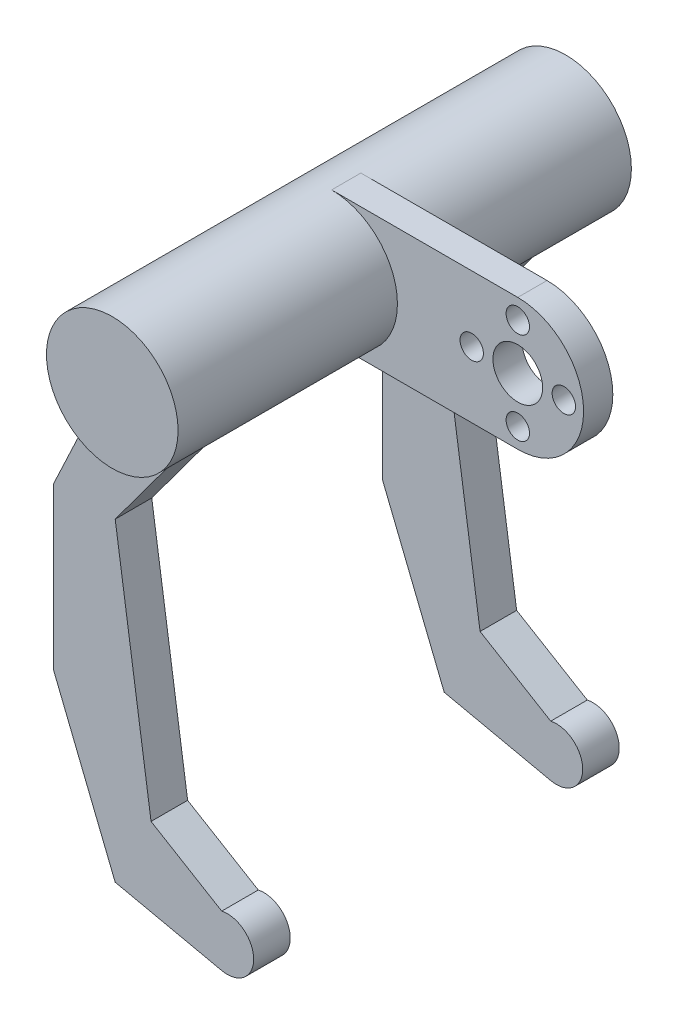
ISO-10303-21;
HEADER;
FILE_DESCRIPTION(('STEP AP214'),'2;1');
FILE_NAME('part.step','',(''),(''),'','','');
FILE_SCHEMA(('AUTOMOTIVE_DESIGN { 1 0 10303 214 1 1 1 1 }'));
ENDSEC;
DATA;
#1=APPLICATION_CONTEXT('core data for automotive mechanical design processes');
#2=APPLICATION_PROTOCOL_DEFINITION('international standard','automotive_design',2000,#1);
#3=PRODUCT_CONTEXT('',#1,'mechanical');
#4=PRODUCT('Part','Part','',(#3));
#5=PRODUCT_RELATED_PRODUCT_CATEGORY('part','',(#4));
#6=PRODUCT_DEFINITION_FORMATION('','',#4);
#7=PRODUCT_DEFINITION_CONTEXT('part definition',#1,'design');
#8=PRODUCT_DEFINITION('design','',#6,#7);
#9=PRODUCT_DEFINITION_SHAPE('','',#8);
#10=(LENGTH_UNIT() NAMED_UNIT(*) SI_UNIT(.MILLI.,.METRE.));
#11=(NAMED_UNIT(*) PLANE_ANGLE_UNIT() SI_UNIT($,.RADIAN.));
#12=(NAMED_UNIT(*) SI_UNIT($,.STERADIAN.) SOLID_ANGLE_UNIT());
#13=UNCERTAINTY_MEASURE_WITH_UNIT(LENGTH_MEASURE(1.E-05),#10,'distance_accuracy_value','');
#14=(GEOMETRIC_REPRESENTATION_CONTEXT(3) GLOBAL_UNCERTAINTY_ASSIGNED_CONTEXT((#13)) GLOBAL_UNIT_ASSIGNED_CONTEXT((#10,
#11,#12)) REPRESENTATION_CONTEXT('',''));
#15=CARTESIAN_POINT('',(0.,0.,0.));
#16=DIRECTION('',(0.,0.,1.));
#17=DIRECTION('',(1.,0.,0.));
#18=AXIS2_PLACEMENT_3D('',#15,#16,#17);
#19=CARTESIAN_POINT('',(0.,0.,5.08));
#20=DIRECTION('',(0.,0.,-1.));
#21=DIRECTION('',(-1.,0.,0.));
#22=AXIS2_PLACEMENT_3D('',#19,#20,#21);
#23=CYLINDRICAL_SURFACE('',#22,11.43);
#24=DIRECTION('',(0.,0.,-1.));
#25=VECTOR('',#24,1.);
#26=CARTESIAN_POINT('',(0.,11.43,5.08));
#27=LINE('',#26,#25);
#28=CARTESIAN_POINT('',(0.,11.43,5.08));
#29=VERTEX_POINT('',#28);
#30=CARTESIAN_POINT('',(0.,11.43,0.));
#31=VERTEX_POINT('',#30);
#32=EDGE_CURVE('E365',#29,#31,#27,.T.);
#33=ORIENTED_EDGE('',*,*,#32,.F.);
#34=CARTESIAN_POINT('',(0.,0.,5.08));
#35=DIRECTION('',(0.,0.,1.));
#36=DIRECTION('',(1.,0.,0.));
#37=AXIS2_PLACEMENT_3D('',#34,#35,#36);
#38=CIRCLE('',#37,11.43);
#39=CARTESIAN_POINT('',(0.,-11.43,5.08));
#40=VERTEX_POINT('',#39);
#41=EDGE_CURVE('E377',#40,#29,#38,.T.);
#42=ORIENTED_EDGE('',*,*,#41,.F.);
#43=DIRECTION('',(0.,0.,-1.));
#44=VECTOR('',#43,1.);
#45=CARTESIAN_POINT('',(0.,-11.43,5.08));
#46=LINE('',#45,#44);
#47=CARTESIAN_POINT('',(0.,-11.43,0.));
#48=VERTEX_POINT('',#47);
#49=EDGE_CURVE('E360',#40,#48,#46,.T.);
#50=ORIENTED_EDGE('',*,*,#49,.T.);
#51=CARTESIAN_POINT('',(0.,0.,0.));
#52=DIRECTION('',(0.,0.,1.));
#53=DIRECTION('',(1.,0.,0.));
#54=AXIS2_PLACEMENT_3D('',#51,#52,#53);
#55=CIRCLE('',#54,11.43);
#56=EDGE_CURVE('E368',#48,#31,#55,.T.);
#57=ORIENTED_EDGE('',*,*,#56,.T.);
#58=EDGE_LOOP('',(#33,#42,#50,#57));
#59=FACE_BOUND('',#58,.T.);
#60=ADVANCED_FACE('F37',(#59),#23,.T.);
#61=CARTESIAN_POINT('',(0.,0.,5.08));
#62=DIRECTION('',(0.,0.,1.));
#63=DIRECTION('',(1.,0.,0.));
#64=AXIS2_PLACEMENT_3D('',#61,#62,#63);
#65=PLANE('',#64);
#66=CARTESIAN_POINT('',(-32.3349284233711,0.,5.08));
#67=DIRECTION('',(0.,0.,1.));
#68=DIRECTION('',(1.,0.,0.));
#69=AXIS2_PLACEMENT_3D('',#66,#67,#68);
#70=CIRCLE('',#69,11.43);
#71=CARTESIAN_POINT('',(-32.3349284233711,-11.43,5.08));
#72=VERTEX_POINT('',#71);
#73=CARTESIAN_POINT('',(-32.3349284233711,11.43,5.08));
#74=VERTEX_POINT('',#73);
#75=EDGE_CURVE('E319',#72,#74,#70,.T.);
#76=ORIENTED_EDGE('',*,*,#75,.F.);
#77=DIRECTION('',(-1.,0.,0.));
#78=VECTOR('',#77,1.);
#79=CARTESIAN_POINT('',(0.,-11.43,5.08));
#80=LINE('',#79,#78);
#81=EDGE_CURVE('E353',#40,#72,#80,.T.);
#82=ORIENTED_EDGE('',*,*,#81,.F.);
#83=ORIENTED_EDGE('',*,*,#41,.T.);
#84=DIRECTION('',(1.,0.,0.));
#85=VECTOR('',#84,1.);
#86=CARTESIAN_POINT('',(0.,11.43,5.08));
#87=LINE('',#86,#85);
#88=EDGE_CURVE('E356',#74,#29,#87,.T.);
#89=ORIENTED_EDGE('',*,*,#88,.F.);
#90=EDGE_LOOP('',(#76,#82,#83,#89));
#91=FACE_BOUND('',#90,.T.);
#92=CARTESIAN_POINT('',(8.001,0.,5.08));
#93=DIRECTION('',(0.,0.,-1.));
#94=DIRECTION('',(0.,-1.,0.));
#95=AXIS2_PLACEMENT_3D('',#92,#93,#94);
#96=CIRCLE('',#95,2.032);
#97=CARTESIAN_POINT('',(8.00099999999998,-2.03200000000008,5.08));
#98=VERTEX_POINT('',#97);
#99=EDGE_CURVE('E323',#98,#98,#96,.T.);
#100=ORIENTED_EDGE('',*,*,#99,.T.);
#101=EDGE_LOOP('',(#100));
#102=FACE_BOUND('',#101,.T.);
#103=CARTESIAN_POINT('',(0.,8.001,5.08));
#104=DIRECTION('',(0.,0.,-1.));
#105=DIRECTION('',(1.,0.,0.));
#106=AXIS2_PLACEMENT_3D('',#103,#104,#105);
#107=CIRCLE('',#106,2.032);
#108=CARTESIAN_POINT('',(2.032,8.001,5.08));
#109=VERTEX_POINT('',#108);
#110=EDGE_CURVE('E329',#109,#109,#107,.T.);
#111=ORIENTED_EDGE('',*,*,#110,.T.);
#112=EDGE_LOOP('',(#111));
#113=FACE_BOUND('',#112,.T.);
#114=CARTESIAN_POINT('',(-8.001,0.,5.08));
#115=DIRECTION('',(0.,0.,-1.));
#116=DIRECTION('',(0.,1.,0.));
#117=AXIS2_PLACEMENT_3D('',#114,#115,#116);
#118=CIRCLE('',#117,2.032);
#119=CARTESIAN_POINT('',(-8.00099999999999,2.03200000000003,5.08));
#120=VERTEX_POINT('',#119);
#121=EDGE_CURVE('E335',#120,#120,#118,.T.);
#122=ORIENTED_EDGE('',*,*,#121,.T.);
#123=EDGE_LOOP('',(#122));
#124=FACE_BOUND('',#123,.T.);
#125=CARTESIAN_POINT('',(0.,-8.001,5.08));
#126=DIRECTION('',(0.,0.,-1.));
#127=DIRECTION('',(-1.,0.,0.));
#128=AXIS2_PLACEMENT_3D('',#125,#126,#127);
#129=CIRCLE('',#128,2.032);
#130=CARTESIAN_POINT('',(-2.032,-8.001,5.08));
#131=VERTEX_POINT('',#130);
#132=EDGE_CURVE('E341',#131,#131,#129,.T.);
#133=ORIENTED_EDGE('',*,*,#132,.T.);
#134=EDGE_LOOP('',(#133));
#135=FACE_BOUND('',#134,.T.);
#136=CARTESIAN_POINT('',(0.,0.,5.08));
#137=DIRECTION('',(0.,0.,-1.));
#138=DIRECTION('',(-1.,0.,0.));
#139=AXIS2_PLACEMENT_3D('',#136,#137,#138);
#140=CIRCLE('',#139,4.318);
#141=CARTESIAN_POINT('',(-4.318,0.,5.08));
#142=VERTEX_POINT('',#141);
#143=EDGE_CURVE('E347',#142,#142,#140,.T.);
#144=ORIENTED_EDGE('',*,*,#143,.T.);
#145=EDGE_LOOP('',(#144));
#146=FACE_BOUND('',#145,.T.);
#147=ADVANCED_FACE('F432',(#91,#102,#113,#124,#135,#146),#65,.T.);
#148=CARTESIAN_POINT('',(0.,0.,0.));
#149=DIRECTION('',(0.,0.,1.));
#150=DIRECTION('',(1.,0.,0.));
#151=AXIS2_PLACEMENT_3D('',#148,#149,#150);
#152=PLANE('',#151);
#153=CARTESIAN_POINT('',(8.001,0.,0.));
#154=DIRECTION('',(0.,0.,-1.));
#155=DIRECTION('',(0.,-1.,0.));
#156=AXIS2_PLACEMENT_3D('',#153,#154,#155);
#157=CIRCLE('',#156,2.032);
#158=CARTESIAN_POINT('',(8.00099999999998,-2.03200000000008,0.));
#159=VERTEX_POINT('',#158);
#160=EDGE_CURVE('E322',#159,#159,#157,.T.);
#161=ORIENTED_EDGE('',*,*,#160,.F.);
#162=EDGE_LOOP('',(#161));
#163=FACE_BOUND('',#162,.T.);
#164=CARTESIAN_POINT('',(0.,8.001,0.));
#165=DIRECTION('',(0.,0.,-1.));
#166=DIRECTION('',(1.,0.,0.));
#167=AXIS2_PLACEMENT_3D('',#164,#165,#166);
#168=CIRCLE('',#167,2.032);
#169=CARTESIAN_POINT('',(2.032,8.001,0.));
#170=VERTEX_POINT('',#169);
#171=EDGE_CURVE('E326',#170,#170,#168,.T.);
#172=ORIENTED_EDGE('',*,*,#171,.F.);
#173=EDGE_LOOP('',(#172));
#174=FACE_BOUND('',#173,.T.);
#175=CARTESIAN_POINT('',(-8.001,0.,0.));
#176=DIRECTION('',(0.,0.,-1.));
#177=DIRECTION('',(0.,1.,0.));
#178=AXIS2_PLACEMENT_3D('',#175,#176,#177);
#179=CIRCLE('',#178,2.032);
#180=CARTESIAN_POINT('',(-8.00099999999999,2.03200000000003,0.));
#181=VERTEX_POINT('',#180);
#182=EDGE_CURVE('E332',#181,#181,#179,.T.);
#183=ORIENTED_EDGE('',*,*,#182,.F.);
#184=EDGE_LOOP('',(#183));
#185=FACE_BOUND('',#184,.T.);
#186=CARTESIAN_POINT('',(0.,-8.001,0.));
#187=DIRECTION('',(0.,0.,-1.));
#188=DIRECTION('',(-1.,0.,0.));
#189=AXIS2_PLACEMENT_3D('',#186,#187,#188);
#190=CIRCLE('',#189,2.032);
#191=CARTESIAN_POINT('',(-2.032,-8.001,0.));
#192=VERTEX_POINT('',#191);
#193=EDGE_CURVE('E338',#192,#192,#190,.T.);
#194=ORIENTED_EDGE('',*,*,#193,.F.);
#195=EDGE_LOOP('',(#194));
#196=FACE_BOUND('',#195,.T.);
#197=CARTESIAN_POINT('',(0.,0.,0.));
#198=DIRECTION('',(0.,0.,-1.));
#199=DIRECTION('',(-1.,0.,0.));
#200=AXIS2_PLACEMENT_3D('',#197,#198,#199);
#201=CIRCLE('',#200,4.318);
#202=CARTESIAN_POINT('',(-4.318,0.,0.));
#203=VERTEX_POINT('',#202);
#204=EDGE_CURVE('E344',#203,#203,#201,.T.);
#205=ORIENTED_EDGE('',*,*,#204,.F.);
#206=EDGE_LOOP('',(#205));
#207=FACE_BOUND('',#206,.T.);
#208=DIRECTION('',(-1.,0.,0.));
#209=VECTOR('',#208,1.);
#210=CARTESIAN_POINT('',(0.,-11.43,0.));
#211=LINE('',#210,#209);
#212=CARTESIAN_POINT('',(-32.3349284233711,-11.43,0.));
#213=VERTEX_POINT('',#212);
#214=EDGE_CURVE('E350',#48,#213,#211,.T.);
#215=ORIENTED_EDGE('',*,*,#214,.T.);
#216=CARTESIAN_POINT('',(-32.3349284233711,0.,0.));
#217=DIRECTION('',(0.,0.,1.));
#218=DIRECTION('',(1.,0.,0.));
#219=AXIS2_PLACEMENT_3D('',#216,#217,#218);
#220=CIRCLE('',#219,11.43);
#221=CARTESIAN_POINT('',(-32.3349284233711,11.43,0.));
#222=VERTEX_POINT('',#221);
#223=EDGE_CURVE('E317',#213,#222,#220,.T.);
#224=ORIENTED_EDGE('',*,*,#223,.T.);
#225=DIRECTION('',(1.,0.,0.));
#226=VECTOR('',#225,1.);
#227=CARTESIAN_POINT('',(0.,11.43,0.));
#228=LINE('',#227,#226);
#229=EDGE_CURVE('E357',#222,#31,#228,.T.);
#230=ORIENTED_EDGE('',*,*,#229,.T.);
#231=ORIENTED_EDGE('',*,*,#56,.F.);
#232=EDGE_LOOP('',(#215,#224,#230,#231));
#233=FACE_BOUND('',#232,.T.);
#234=ADVANCED_FACE('F437',(#163,#174,#185,#196,#207,#233),#152,.F.);
#235=CARTESIAN_POINT('',(0.,11.43,5.08));
#236=DIRECTION('',(0.,1.,0.));
#237=DIRECTION('',(0.,0.,1.));
#238=AXIS2_PLACEMENT_3D('',#235,#236,#237);
#239=PLANE('',#238);
#240=ORIENTED_EDGE('',*,*,#229,.F.);
#241=DIRECTION('',(0.,0.,-1.));
#242=VECTOR('',#241,1.);
#243=CARTESIAN_POINT('',(-32.3349284233711,11.43,5.08));
#244=LINE('',#243,#242);
#245=EDGE_CURVE('E369',#74,#222,#244,.T.);
#246=ORIENTED_EDGE('',*,*,#245,.F.);
#247=ORIENTED_EDGE('',*,*,#88,.T.);
#248=ORIENTED_EDGE('',*,*,#32,.T.);
#249=EDGE_LOOP('',(#240,#246,#247,#248));
#250=FACE_BOUND('',#249,.T.);
#251=ADVANCED_FACE('F446',(#250),#239,.T.);
#252=CARTESIAN_POINT('',(-32.3349284233711,0.,5.08));
#253=DIRECTION('',(0.,0.,-1.));
#254=DIRECTION('',(-1.,0.,0.));
#255=AXIS2_PLACEMENT_3D('',#252,#253,#254);
#256=CYLINDRICAL_SURFACE('',#255,11.43);
#257=CARTESIAN_POINT('',(-32.3349284233711,0.,25.4));
#258=DIRECTION('',(0.,0.,-1.));
#259=DIRECTION('',(-1.,0.,0.));
#260=AXIS2_PLACEMENT_3D('',#257,#258,#259);
#261=CIRCLE('',#260,11.43);
#262=CARTESIAN_POINT('',(-42.3406749358484,-5.5253901878555,25.4));
#263=VERTEX_POINT('',#262);
#264=CARTESIAN_POINT('',(-28.9893938916271,-10.9294235299447,25.4));
#265=VERTEX_POINT('',#264);
#266=EDGE_CURVE('E11',#263,#265,#261,.F.);
#267=ORIENTED_EDGE('',*,*,#266,.F.);
#268=DIRECTION('',(0.,0.,-1.));
#269=VECTOR('',#268,1.);
#270=CARTESIAN_POINT('',(-42.3406749358484,-5.5253901878555,5.08));
#271=LINE('',#270,#269);
#272=CARTESIAN_POINT('',(-42.3406749358484,-5.5253901878555,31.75));
#273=VERTEX_POINT('',#272);
#274=EDGE_CURVE('E44',#273,#263,#271,.T.);
#275=ORIENTED_EDGE('',*,*,#274,.F.);
#276=CARTESIAN_POINT('',(-32.3349284233711,0.,31.75));
#277=DIRECTION('',(0.,0.,-1.));
#278=DIRECTION('',(-1.,0.,0.));
#279=AXIS2_PLACEMENT_3D('',#276,#277,#278);
#280=CIRCLE('',#279,11.43);
#281=CARTESIAN_POINT('',(-28.9893938916271,-10.9294235299447,31.75));
#282=VERTEX_POINT('',#281);
#283=EDGE_CURVE('E392',#273,#282,#280,.F.);
#284=ORIENTED_EDGE('',*,*,#283,.T.);
#285=DIRECTION('',(0.,0.,-1.));
#286=VECTOR('',#285,1.);
#287=CARTESIAN_POINT('',(-28.9893938916271,-10.9294235299447,5.08));
#288=LINE('',#287,#286);
#289=EDGE_CURVE('E395',#265,#282,#288,.F.);
#290=ORIENTED_EDGE('',*,*,#289,.F.);
#291=EDGE_LOOP('',(#267,#275,#284,#290));
#292=FACE_BOUND('',#291,.T.);
#293=CARTESIAN_POINT('',(-32.3349284233711,0.,-25.4));
#294=DIRECTION('',(0.,0.,1.));
#295=DIRECTION('',(1.,0.,0.));
#296=AXIS2_PLACEMENT_3D('',#293,#294,#295);
#297=CIRCLE('',#296,11.43);
#298=CARTESIAN_POINT('',(-28.9893938916271,-10.9294235299447,-25.4));
#299=VERTEX_POINT('',#298);
#300=CARTESIAN_POINT('',(-42.3406749358484,-5.5253901878555,-25.4));
#301=VERTEX_POINT('',#300);
#302=EDGE_CURVE('E390',#299,#301,#297,.F.);
#303=ORIENTED_EDGE('',*,*,#302,.F.);
#304=DIRECTION('',(0.,0.,-1.));
#305=VECTOR('',#304,1.);
#306=CARTESIAN_POINT('',(-28.9893938916271,-10.9294235299447,5.08));
#307=LINE('',#306,#305);
#308=CARTESIAN_POINT('',(-28.9893938916271,-10.9294235299447,-31.75));
#309=VERTEX_POINT('',#308);
#310=EDGE_CURVE('E387',#299,#309,#307,.T.);
#311=ORIENTED_EDGE('',*,*,#310,.T.);
#312=CARTESIAN_POINT('',(-32.3349284233711,0.,-31.75));
#313=DIRECTION('',(0.,0.,1.));
#314=DIRECTION('',(1.,0.,0.));
#315=AXIS2_PLACEMENT_3D('',#312,#313,#314);
#316=CIRCLE('',#315,11.43);
#317=CARTESIAN_POINT('',(-42.3406749358484,-5.5253901878555,-31.75));
#318=VERTEX_POINT('',#317);
#319=EDGE_CURVE('E380',#309,#318,#316,.F.);
#320=ORIENTED_EDGE('',*,*,#319,.T.);
#321=DIRECTION('',(0.,0.,-1.));
#322=VECTOR('',#321,1.);
#323=CARTESIAN_POINT('',(-42.3406749358484,-5.5253901878555,5.08));
#324=LINE('',#323,#322);
#325=EDGE_CURVE('E384',#318,#301,#324,.F.);
#326=ORIENTED_EDGE('',*,*,#325,.T.);
#327=EDGE_LOOP('',(#303,#311,#320,#326));
#328=FACE_BOUND('',#327,.T.);
#329=ORIENTED_EDGE('',*,*,#245,.T.);
#330=ORIENTED_EDGE('',*,*,#223,.F.);
#331=DIRECTION('',(0.,0.,-1.));
#332=VECTOR('',#331,1.);
#333=CARTESIAN_POINT('',(-32.3349284233711,-11.43,5.08));
#334=LINE('',#333,#332);
#335=EDGE_CURVE('E372',#72,#213,#334,.T.);
#336=ORIENTED_EDGE('',*,*,#335,.F.);
#337=ORIENTED_EDGE('',*,*,#75,.T.);
#338=EDGE_LOOP('',(#329,#330,#336,#337));
#339=FACE_BOUND('',#338,.T.);
#340=CARTESIAN_POINT('',(-32.3349284233711,0.,-35.56));
#341=DIRECTION('',(0.,0.,1.));
#342=DIRECTION('',(1.,0.,0.));
#343=AXIS2_PLACEMENT_3D('',#340,#341,#342);
#344=CIRCLE('',#343,11.43);
#345=CARTESIAN_POINT('',(-20.9049284233711,0.,-35.56));
#346=VERTEX_POINT('',#345);
#347=EDGE_CURVE('E314',#346,#346,#344,.T.);
#348=ORIENTED_EDGE('',*,*,#347,.T.);
#349=EDGE_LOOP('',(#348));
#350=FACE_BOUND('',#349,.T.);
#351=CARTESIAN_POINT('',(-32.3349284233711,0.,43.18));
#352=DIRECTION('',(0.,0.,1.));
#353=DIRECTION('',(1.,0.,0.));
#354=AXIS2_PLACEMENT_3D('',#351,#352,#353);
#355=CIRCLE('',#354,11.43);
#356=CARTESIAN_POINT('',(-20.9049284233711,0.,43.18));
#357=VERTEX_POINT('',#356);
#358=EDGE_CURVE('E311',#357,#357,#355,.T.);
#359=ORIENTED_EDGE('',*,*,#358,.F.);
#360=EDGE_LOOP('',(#359));
#361=FACE_BOUND('',#360,.T.);
#362=ADVANCED_FACE('F405',(#292,#328,#339,#350,#361),#256,.T.);
#363=CARTESIAN_POINT('',(0.,-11.43,5.08));
#364=DIRECTION('',(0.,-1.,0.));
#365=DIRECTION('',(0.,0.,-1.));
#366=AXIS2_PLACEMENT_3D('',#363,#364,#365);
#367=PLANE('',#366);
#368=ORIENTED_EDGE('',*,*,#214,.F.);
#369=ORIENTED_EDGE('',*,*,#49,.F.);
#370=ORIENTED_EDGE('',*,*,#81,.T.);
#371=ORIENTED_EDGE('',*,*,#335,.T.);
#372=EDGE_LOOP('',(#368,#369,#370,#371));
#373=FACE_BOUND('',#372,.T.);
#374=ADVANCED_FACE('F452',(#373),#367,.T.);
#375=CARTESIAN_POINT('',(0.,0.,5.08));
#376=DIRECTION('',(0.,0.,-1.));
#377=DIRECTION('',(-1.,0.,0.));
#378=AXIS2_PLACEMENT_3D('',#375,#376,#377);
#379=CYLINDRICAL_SURFACE('',#378,4.318);
#380=ORIENTED_EDGE('',*,*,#143,.F.);
#381=EDGE_LOOP('',(#380));
#382=FACE_BOUND('',#381,.T.);
#383=ORIENTED_EDGE('',*,*,#204,.T.);
#384=EDGE_LOOP('',(#383));
#385=FACE_BOUND('',#384,.T.);
#386=ADVANCED_FACE('F465',(#382,#385),#379,.F.);
#387=CARTESIAN_POINT('',(0.,-8.001,5.08));
#388=DIRECTION('',(0.,0.,-1.));
#389=DIRECTION('',(-1.,0.,0.));
#390=AXIS2_PLACEMENT_3D('',#387,#388,#389);
#391=CYLINDRICAL_SURFACE('',#390,2.032);
#392=ORIENTED_EDGE('',*,*,#132,.F.);
#393=EDGE_LOOP('',(#392));
#394=FACE_BOUND('',#393,.T.);
#395=ORIENTED_EDGE('',*,*,#193,.T.);
#396=EDGE_LOOP('',(#395));
#397=FACE_BOUND('',#396,.T.);
#398=ADVANCED_FACE('F470',(#394,#397),#391,.F.);
#399=CARTESIAN_POINT('',(-8.001,0.,5.08));
#400=DIRECTION('',(0.,0.,-1.));
#401=DIRECTION('',(-1.,0.,0.));
#402=AXIS2_PLACEMENT_3D('',#399,#400,#401);
#403=CYLINDRICAL_SURFACE('',#402,2.032);
#404=ORIENTED_EDGE('',*,*,#121,.F.);
#405=EDGE_LOOP('',(#404));
#406=FACE_BOUND('',#405,.T.);
#407=ORIENTED_EDGE('',*,*,#182,.T.);
#408=EDGE_LOOP('',(#407));
#409=FACE_BOUND('',#408,.T.);
#410=ADVANCED_FACE('F474',(#406,#409),#403,.F.);
#411=CARTESIAN_POINT('',(0.,8.001,5.08));
#412=DIRECTION('',(0.,0.,-1.));
#413=DIRECTION('',(-1.,0.,0.));
#414=AXIS2_PLACEMENT_3D('',#411,#412,#413);
#415=CYLINDRICAL_SURFACE('',#414,2.032);
#416=ORIENTED_EDGE('',*,*,#110,.F.);
#417=EDGE_LOOP('',(#416));
#418=FACE_BOUND('',#417,.T.);
#419=ORIENTED_EDGE('',*,*,#171,.T.);
#420=EDGE_LOOP('',(#419));
#421=FACE_BOUND('',#420,.T.);
#422=ADVANCED_FACE('F478',(#418,#421),#415,.F.);
#423=CARTESIAN_POINT('',(8.001,0.,5.08));
#424=DIRECTION('',(0.,0.,-1.));
#425=DIRECTION('',(-1.,0.,0.));
#426=AXIS2_PLACEMENT_3D('',#423,#424,#425);
#427=CYLINDRICAL_SURFACE('',#426,2.032);
#428=ORIENTED_EDGE('',*,*,#99,.F.);
#429=EDGE_LOOP('',(#428));
#430=FACE_BOUND('',#429,.T.);
#431=ORIENTED_EDGE('',*,*,#160,.T.);
#432=EDGE_LOOP('',(#431));
#433=FACE_BOUND('',#432,.T.);
#434=ADVANCED_FACE('F482',(#430,#433),#427,.F.);
#435=CARTESIAN_POINT('',(-32.3349284233711,0.,-35.56));
#436=DIRECTION('',(0.,0.,1.));
#437=DIRECTION('',(1.,0.,0.));
#438=AXIS2_PLACEMENT_3D('',#435,#436,#437);
#439=PLANE('',#438);
#440=ORIENTED_EDGE('',*,*,#347,.F.);
#441=EDGE_LOOP('',(#440));
#442=FACE_BOUND('',#441,.T.);
#443=ADVANCED_FACE('F486',(#442),#439,.F.);
#444=CARTESIAN_POINT('',(-32.3349284233711,0.,43.18));
#445=DIRECTION('',(0.,0.,1.));
#446=DIRECTION('',(1.,0.,0.));
#447=AXIS2_PLACEMENT_3D('',#444,#445,#446);
#448=PLANE('',#447);
#449=ORIENTED_EDGE('',*,*,#358,.T.);
#450=EDGE_LOOP('',(#449));
#451=FACE_BOUND('',#450,.T.);
#452=ADVANCED_FACE('F490',(#451),#448,.T.);
#453=CARTESIAN_POINT('',(-19.6126188759609,-89.9951673660762,-25.4));
#454=DIRECTION('',(0.21293191641022,0.977067039140033,0.));
#455=DIRECTION('',(-0.977067039140033,0.21293191641022,0.));
#456=AXIS2_PLACEMENT_3D('',#453,#454,#455);
#457=PLANE('',#456);
#458=DIRECTION('',(0.977067039140033,-0.21293191641022,0.));
#459=VECTOR('',#458,1.);
#460=CARTESIAN_POINT('',(-19.6126188759609,-89.9951673660762,-31.75));
#461=LINE('',#460,#459);
#462=CARTESIAN_POINT('',(-43.2582780653794,-84.8420762021196,-31.75));
#463=VERTEX_POINT('',#462);
#464=CARTESIAN_POINT('',(-24.7565964514207,-88.8741419305259,-31.75));
#465=VERTEX_POINT('',#464);
#466=EDGE_CURVE('E196',#463,#465,#461,.T.);
#467=ORIENTED_EDGE('',*,*,#466,.T.);
#468=DIRECTION('',(0.,0.,-1.));
#469=VECTOR('',#468,1.);
#470=CARTESIAN_POINT('',(-24.7565964514207,-88.8741419305259,-25.4));
#471=LINE('',#470,#469);
#472=CARTESIAN_POINT('',(-24.7565964514207,-88.8741419305259,-25.4));
#473=VERTEX_POINT('',#472);
#474=EDGE_CURVE('E308',#473,#465,#471,.T.);
#475=ORIENTED_EDGE('',*,*,#474,.F.);
#476=DIRECTION('',(0.977067039140033,-0.21293191641022,0.));
#477=VECTOR('',#476,1.);
#478=CARTESIAN_POINT('',(-19.6126188759609,-89.9951673660762,-25.4));
#479=LINE('',#478,#477);
#480=CARTESIAN_POINT('',(-43.2582780653794,-84.8420762021196,-25.4));
#481=VERTEX_POINT('',#480);
#482=EDGE_CURVE('E256',#481,#473,#479,.T.);
#483=ORIENTED_EDGE('',*,*,#482,.F.);
#484=DIRECTION('',(0.,0.,-1.));
#485=VECTOR('',#484,1.);
#486=CARTESIAN_POINT('',(-43.2582780653794,-84.8420762021196,-25.4));
#487=LINE('',#486,#485);
#488=EDGE_CURVE('E275',#481,#463,#487,.T.);
#489=ORIENTED_EDGE('',*,*,#488,.T.);
#490=EDGE_LOOP('',(#467,#475,#483,#489));
#491=FACE_BOUND('',#490,.T.);
#492=ADVANCED_FACE('F494',(#491),#457,.F.);
#493=CARTESIAN_POINT('',(-23.782450871958,-84.404142537935,-25.4));
#494=DIRECTION('',(0.,0.,-1.));
#495=DIRECTION('',(-1.,0.,0.));
#496=AXIS2_PLACEMENT_3D('',#493,#494,#495);
#497=CYLINDRICAL_SURFACE('',#496,4.57491575657402);
#498=CARTESIAN_POINT('',(-23.782450871958,-84.404142537935,-31.75));
#499=DIRECTION('',(0.,0.,1.));
#500=DIRECTION('',(1.,0.,0.));
#501=AXIS2_PLACEMENT_3D('',#498,#499,#500);
#502=CIRCLE('',#501,4.57491575657402);
#503=CARTESIAN_POINT('',(-24.7565964514207,-79.9341431453442,-31.75));
#504=VERTEX_POINT('',#503);
#505=EDGE_CURVE('E278',#465,#504,#502,.T.);
#506=ORIENTED_EDGE('',*,*,#505,.T.);
#507=DIRECTION('',(0.,0.,-1.));
#508=VECTOR('',#507,1.);
#509=CARTESIAN_POINT('',(-24.7565964514207,-79.9341431453442,-25.4));
#510=LINE('',#509,#508);
#511=CARTESIAN_POINT('',(-24.7565964514207,-79.9341431453442,-25.4));
#512=VERTEX_POINT('',#511);
#513=EDGE_CURVE('E305',#512,#504,#510,.T.);
#514=ORIENTED_EDGE('',*,*,#513,.F.);
#515=CARTESIAN_POINT('',(-23.782450871958,-84.404142537935,-25.4));
#516=DIRECTION('',(0.,0.,1.));
#517=DIRECTION('',(1.,0.,0.));
#518=AXIS2_PLACEMENT_3D('',#515,#516,#517);
#519=CIRCLE('',#518,4.57491575657402);
#520=EDGE_CURVE('E259',#473,#512,#519,.T.);
#521=ORIENTED_EDGE('',*,*,#520,.F.);
#522=ORIENTED_EDGE('',*,*,#474,.T.);
#523=EDGE_LOOP('',(#506,#514,#521,#522));
#524=FACE_BOUND('',#523,.T.);
#525=ADVANCED_FACE('F498',(#524),#497,.T.);
#526=CARTESIAN_POINT('',(-41.7778302735173,-69.737133588558,-25.4));
#527=DIRECTION('',(-0.513912692768161,-0.857842493824932,0.));
#528=DIRECTION('',(0.857842493824932,-0.513912692768161,0.));
#529=AXIS2_PLACEMENT_3D('',#526,#527,#528);
#530=PLANE('',#529);
#531=DIRECTION('',(-0.857842493824932,0.513912692768161,0.));
#532=VECTOR('',#531,1.);
#533=CARTESIAN_POINT('',(-41.7778302735173,-69.737133588558,-31.75));
#534=LINE('',#533,#532);
#535=CARTESIAN_POINT('',(-37.0287334536283,-72.582202645517,-31.75));
#536=VERTEX_POINT('',#535);
#537=EDGE_CURVE('E280',#504,#536,#534,.T.);
#538=ORIENTED_EDGE('',*,*,#537,.T.);
#539=DIRECTION('',(0.,0.,-1.));
#540=VECTOR('',#539,1.);
#541=CARTESIAN_POINT('',(-37.0287334536283,-72.582202645517,-25.4));
#542=LINE('',#541,#540);
#543=CARTESIAN_POINT('',(-37.0287334536283,-72.582202645517,-25.4));
#544=VERTEX_POINT('',#543);
#545=EDGE_CURVE('E302',#544,#536,#542,.T.);
#546=ORIENTED_EDGE('',*,*,#545,.F.);
#547=DIRECTION('',(-0.857842493824932,0.513912692768161,0.));
#548=VECTOR('',#547,1.);
#549=CARTESIAN_POINT('',(-41.7778302735173,-69.737133588558,-25.4));
#550=LINE('',#549,#548);
#551=EDGE_CURVE('E262',#512,#544,#550,.T.);
#552=ORIENTED_EDGE('',*,*,#551,.F.);
#553=ORIENTED_EDGE('',*,*,#513,.T.);
#554=EDGE_LOOP('',(#538,#546,#552,#553));
#555=FACE_BOUND('',#554,.T.);
#556=ADVANCED_FACE('F502',(#555),#530,.F.);
#557=CARTESIAN_POINT('',(-46.69245255912,-6.86625995800534,-25.4));
#558=DIRECTION('',(-0.989359980769738,-0.14548824162558,0.));
#559=DIRECTION('',(0.14548824162558,-0.989359980769738,0.));
#560=AXIS2_PLACEMENT_3D('',#557,#558,#559);
#561=PLANE('',#560);
#562=DIRECTION('',(-0.14548824162558,0.989359980769738,0.));
#563=VECTOR('',#562,1.);
#564=CARTESIAN_POINT('',(-46.69245255912,-6.86625995800534,-31.75));
#565=LINE('',#564,#563);
#566=CARTESIAN_POINT('',(-43.2582780653794,-30.2195892245116,-31.75));
#567=VERTEX_POINT('',#566);
#568=EDGE_CURVE('E282',#536,#567,#565,.T.);
#569=ORIENTED_EDGE('',*,*,#568,.T.);
#570=DIRECTION('',(0.,0.,-1.));
#571=VECTOR('',#570,1.);
#572=CARTESIAN_POINT('',(-43.2582780653794,-30.2195892245116,-25.4));
#573=LINE('',#572,#571);
#574=CARTESIAN_POINT('',(-43.2582780653794,-30.2195892245116,-25.4));
#575=VERTEX_POINT('',#574);
#576=EDGE_CURVE('E299',#575,#567,#573,.T.);
#577=ORIENTED_EDGE('',*,*,#576,.F.);
#578=DIRECTION('',(-0.14548824162558,0.989359980769738,0.));
#579=VECTOR('',#578,1.);
#580=CARTESIAN_POINT('',(-46.69245255912,-6.86625995800534,-25.4));
#581=LINE('',#580,#579);
#582=EDGE_CURVE('E264',#544,#575,#581,.T.);
#583=ORIENTED_EDGE('',*,*,#582,.F.);
#584=ORIENTED_EDGE('',*,*,#545,.T.);
#585=EDGE_LOOP('',(#569,#577,#583,#584));
#586=FACE_BOUND('',#585,.T.);
#587=ADVANCED_FACE('F506',(#586),#561,.F.);
#588=CARTESIAN_POINT('',(-13.5118762818529,9.99469888898521,-25.4));
#589=DIRECTION('',(-0.803958234088395,0.594685763947204,0.));
#590=DIRECTION('',(-0.594685763947204,-0.803958234088395,0.));
#591=AXIS2_PLACEMENT_3D('',#588,#589,#590);
#592=PLANE('',#591);
#593=ORIENTED_EDGE('',*,*,#310,.F.);
#594=DIRECTION('',(0.594685763947204,0.803958234088395,0.));
#595=VECTOR('',#594,1.);
#596=CARTESIAN_POINT('',(-13.5118762818529,9.99469888898521,-25.4));
#597=LINE('',#596,#595);
#598=EDGE_CURVE('E266',#575,#299,#597,.T.);
#599=ORIENTED_EDGE('',*,*,#598,.F.);
#600=ORIENTED_EDGE('',*,*,#576,.T.);
#601=DIRECTION('',(0.594685763947204,0.803958234088395,0.));
#602=VECTOR('',#601,1.);
#603=CARTESIAN_POINT('',(-13.5118762818529,9.99469888898521,-31.75));
#604=LINE('',#603,#602);
#605=EDGE_CURVE('E284',#567,#309,#604,.T.);
#606=ORIENTED_EDGE('',*,*,#605,.T.);
#607=EDGE_LOOP('',(#593,#599,#600,#606));
#608=FACE_BOUND('',#607,.T.);
#609=ADVANCED_FACE('F510',(#608),#592,.F.);
#610=CARTESIAN_POINT('',(-32.5487555072774,15.302389340127,-25.4));
#611=DIRECTION('',(0.90497580646386,-0.425463029786473,0.));
#612=DIRECTION('',(0.425463029786473,0.90497580646386,0.));
#613=AXIS2_PLACEMENT_3D('',#610,#611,#612);
#614=PLANE('',#613);
#615=ORIENTED_EDGE('',*,*,#325,.F.);
#616=DIRECTION('',(-0.425463029786473,-0.90497580646386,0.));
#617=VECTOR('',#616,1.);
#618=CARTESIAN_POINT('',(-32.5487555072774,15.302389340127,-31.75));
#619=LINE('',#618,#617);
#620=CARTESIAN_POINT('',(-53.9503430233736,-30.2195892245116,-31.75));
#621=VERTEX_POINT('',#620);
#622=EDGE_CURVE('E59',#318,#621,#619,.T.);
#623=ORIENTED_EDGE('',*,*,#622,.T.);
#624=DIRECTION('',(0.,0.,-1.));
#625=VECTOR('',#624,1.);
#626=CARTESIAN_POINT('',(-53.9503430233736,-30.2195892245116,-25.4));
#627=LINE('',#626,#625);
#628=CARTESIAN_POINT('',(-53.9503430233736,-30.2195892245116,-25.4));
#629=VERTEX_POINT('',#628);
#630=EDGE_CURVE('E296',#629,#621,#627,.T.);
#631=ORIENTED_EDGE('',*,*,#630,.F.);
#632=DIRECTION('',(-0.425463029786473,-0.90497580646386,0.));
#633=VECTOR('',#632,1.);
#634=CARTESIAN_POINT('',(-32.5487555072774,15.302389340127,-25.4));
#635=LINE('',#634,#633);
#636=EDGE_CURVE('E269',#301,#629,#635,.T.);
#637=ORIENTED_EDGE('',*,*,#636,.F.);
#638=EDGE_LOOP('',(#615,#623,#631,#637));
#639=FACE_BOUND('',#638,.T.);
#640=ADVANCED_FACE('F514',(#639),#614,.F.);
#641=CARTESIAN_POINT('',(-53.9503430233736,0.,-25.4));
#642=DIRECTION('',(1.,0.,0.));
#643=DIRECTION('',(0.,1.,0.));
#644=AXIS2_PLACEMENT_3D('',#641,#642,#643);
#645=PLANE('',#644);
#646=DIRECTION('',(0.,-1.,0.));
#647=VECTOR('',#646,1.);
#648=CARTESIAN_POINT('',(-53.9503430233736,0.,-31.75));
#649=LINE('',#648,#647);
#650=CARTESIAN_POINT('',(-53.9503430233736,-58.3083455805149,-31.75));
#651=VERTEX_POINT('',#650);
#652=EDGE_CURVE('E288',#621,#651,#649,.T.);
#653=ORIENTED_EDGE('',*,*,#652,.T.);
#654=DIRECTION('',(0.,0.,-1.));
#655=VECTOR('',#654,1.);
#656=CARTESIAN_POINT('',(-53.9503430233736,-58.3083455805149,-25.4));
#657=LINE('',#656,#655);
#658=CARTESIAN_POINT('',(-53.9503430233736,-58.3083455805149,-25.4));
#659=VERTEX_POINT('',#658);
#660=EDGE_CURVE('E293',#659,#651,#657,.T.);
#661=ORIENTED_EDGE('',*,*,#660,.F.);
#662=DIRECTION('',(0.,-1.,0.));
#663=VECTOR('',#662,1.);
#664=CARTESIAN_POINT('',(-53.9503430233736,0.,-25.4));
#665=LINE('',#664,#663);
#666=EDGE_CURVE('E271',#629,#659,#665,.T.);
#667=ORIENTED_EDGE('',*,*,#666,.F.);
#668=ORIENTED_EDGE('',*,*,#630,.T.);
#669=EDGE_LOOP('',(#653,#661,#667,#668));
#670=FACE_BOUND('',#669,.T.);
#671=ADVANCED_FACE('F518',(#670),#645,.F.);
#672=CARTESIAN_POINT('',(-66.6275189160173,-26.8483075523499,-25.4));
#673=DIRECTION('',(0.927526558807421,0.373757251042524,0.));
#674=DIRECTION('',(-0.373757251042524,0.927526558807421,0.));
#675=AXIS2_PLACEMENT_3D('',#672,#673,#674);
#676=PLANE('',#675);
#677=DIRECTION('',(0.373757251042524,-0.927526558807421,0.));
#678=VECTOR('',#677,1.);
#679=CARTESIAN_POINT('',(-66.6275189160173,-26.8483075523499,-31.75));
#680=LINE('',#679,#678);
#681=EDGE_CURVE('E260',#651,#463,#680,.T.);
#682=ORIENTED_EDGE('',*,*,#681,.T.);
#683=ORIENTED_EDGE('',*,*,#488,.F.);
#684=DIRECTION('',(0.373757251042524,-0.927526558807421,0.));
#685=VECTOR('',#684,1.);
#686=CARTESIAN_POINT('',(-66.6275189160173,-26.8483075523499,-25.4));
#687=LINE('',#686,#685);
#688=EDGE_CURVE('E273',#659,#481,#687,.T.);
#689=ORIENTED_EDGE('',*,*,#688,.F.);
#690=ORIENTED_EDGE('',*,*,#660,.T.);
#691=EDGE_LOOP('',(#682,#683,#689,#690));
#692=FACE_BOUND('',#691,.T.);
#693=ADVANCED_FACE('F522',(#692),#676,.F.);
#694=CARTESIAN_POINT('',(0.,0.,-25.4));
#695=DIRECTION('',(0.,0.,1.));
#696=DIRECTION('',(1.,0.,0.));
#697=AXIS2_PLACEMENT_3D('',#694,#695,#696);
#698=PLANE('',#697);
#699=ORIENTED_EDGE('',*,*,#598,.T.);
#700=ORIENTED_EDGE('',*,*,#302,.T.);
#701=ORIENTED_EDGE('',*,*,#636,.T.);
#702=ORIENTED_EDGE('',*,*,#666,.T.);
#703=ORIENTED_EDGE('',*,*,#688,.T.);
#704=ORIENTED_EDGE('',*,*,#482,.T.);
#705=ORIENTED_EDGE('',*,*,#520,.T.);
#706=ORIENTED_EDGE('',*,*,#551,.T.);
#707=ORIENTED_EDGE('',*,*,#582,.T.);
#708=EDGE_LOOP('',(#699,#700,#701,#702,#703,#704,#705,#706,#707));
#709=FACE_BOUND('',#708,.T.);
#710=ADVANCED_FACE('F526',(#709),#698,.T.);
#711=CARTESIAN_POINT('',(0.,0.,-31.75));
#712=DIRECTION('',(0.,0.,1.));
#713=DIRECTION('',(1.,0.,0.));
#714=AXIS2_PLACEMENT_3D('',#711,#712,#713);
#715=PLANE('',#714);
#716=ORIENTED_EDGE('',*,*,#319,.F.);
#717=ORIENTED_EDGE('',*,*,#605,.F.);
#718=ORIENTED_EDGE('',*,*,#568,.F.);
#719=ORIENTED_EDGE('',*,*,#537,.F.);
#720=ORIENTED_EDGE('',*,*,#505,.F.);
#721=ORIENTED_EDGE('',*,*,#466,.F.);
#722=ORIENTED_EDGE('',*,*,#681,.F.);
#723=ORIENTED_EDGE('',*,*,#652,.F.);
#724=ORIENTED_EDGE('',*,*,#622,.F.);
#725=EDGE_LOOP('',(#716,#717,#718,#719,#720,#721,#722,#723,#724));
#726=FACE_BOUND('',#725,.T.);
#727=ADVANCED_FACE('F528',(#726),#715,.F.);
#728=CARTESIAN_POINT('',(-19.6126188759609,-89.9951673660762,25.4));
#729=DIRECTION('',(-0.21293191641022,-0.977067039140033,0.));
#730=DIRECTION('',(0.977067039140033,-0.21293191641022,0.));
#731=AXIS2_PLACEMENT_3D('',#728,#729,#730);
#732=PLANE('',#731);
#733=DIRECTION('',(0.977067039140033,-0.21293191641022,0.));
#734=VECTOR('',#733,1.);
#735=CARTESIAN_POINT('',(-19.6126188759609,-89.9951673660762,31.75));
#736=LINE('',#735,#734);
#737=CARTESIAN_POINT('',(-43.2582780653794,-84.8420762021196,31.75));
#738=VERTEX_POINT('',#737);
#739=CARTESIAN_POINT('',(-24.7565964514207,-88.8741419305259,31.75));
#740=VERTEX_POINT('',#739);
#741=EDGE_CURVE('E191',#738,#740,#736,.T.);
#742=ORIENTED_EDGE('',*,*,#741,.F.);
#743=DIRECTION('',(0.,0.,1.));
#744=VECTOR('',#743,1.);
#745=CARTESIAN_POINT('',(-43.2582780653794,-84.8420762021196,25.4));
#746=LINE('',#745,#744);
#747=CARTESIAN_POINT('',(-43.2582780653794,-84.8420762021196,25.4));
#748=VERTEX_POINT('',#747);
#749=EDGE_CURVE('E185',#748,#738,#746,.T.);
#750=ORIENTED_EDGE('',*,*,#749,.F.);
#751=DIRECTION('',(0.977067039140033,-0.21293191641022,0.));
#752=VECTOR('',#751,1.);
#753=CARTESIAN_POINT('',(-19.6126188759609,-89.9951673660762,25.4));
#754=LINE('',#753,#752);
#755=CARTESIAN_POINT('',(-24.7565964514207,-88.8741419305259,25.4));
#756=VERTEX_POINT('',#755);
#757=EDGE_CURVE('E188',#748,#756,#754,.T.);
#758=ORIENTED_EDGE('',*,*,#757,.T.);
#759=DIRECTION('',(0.,0.,1.));
#760=VECTOR('',#759,1.);
#761=CARTESIAN_POINT('',(-24.7565964514207,-88.8741419305259,25.4));
#762=LINE('',#761,#760);
#763=EDGE_CURVE('E228',#756,#740,#762,.T.);
#764=ORIENTED_EDGE('',*,*,#763,.T.);
#765=EDGE_LOOP('',(#742,#750,#758,#764));
#766=FACE_BOUND('',#765,.T.);
#767=ADVANCED_FACE('F187',(#766),#732,.T.);
#768=CARTESIAN_POINT('',(-66.6275189160173,-26.8483075523499,25.4));
#769=DIRECTION('',(-0.927526558807421,-0.373757251042524,0.));
#770=DIRECTION('',(0.373757251042524,-0.927526558807421,0.));
#771=AXIS2_PLACEMENT_3D('',#768,#769,#770);
#772=PLANE('',#771);
#773=DIRECTION('',(0.373757251042524,-0.927526558807421,0.));
#774=VECTOR('',#773,1.);
#775=CARTESIAN_POINT('',(-66.6275189160173,-26.8483075523499,31.75));
#776=LINE('',#775,#774);
#777=CARTESIAN_POINT('',(-53.9503430233736,-58.3083455805149,31.75));
#778=VERTEX_POINT('',#777);
#779=EDGE_CURVE('E230',#778,#738,#776,.T.);
#780=ORIENTED_EDGE('',*,*,#779,.F.);
#781=DIRECTION('',(0.,0.,1.));
#782=VECTOR('',#781,1.);
#783=CARTESIAN_POINT('',(-53.9503430233736,-58.3083455805149,25.4));
#784=LINE('',#783,#782);
#785=CARTESIAN_POINT('',(-53.9503430233736,-58.3083455805149,25.4));
#786=VERTEX_POINT('',#785);
#787=EDGE_CURVE('E197',#786,#778,#784,.T.);
#788=ORIENTED_EDGE('',*,*,#787,.F.);
#789=DIRECTION('',(0.373757251042524,-0.927526558807421,0.));
#790=VECTOR('',#789,1.);
#791=CARTESIAN_POINT('',(-66.6275189160173,-26.8483075523499,25.4));
#792=LINE('',#791,#790);
#793=EDGE_CURVE('E204',#786,#748,#792,.T.);
#794=ORIENTED_EDGE('',*,*,#793,.T.);
#795=ORIENTED_EDGE('',*,*,#749,.T.);
#796=EDGE_LOOP('',(#780,#788,#794,#795));
#797=FACE_BOUND('',#796,.T.);
#798=ADVANCED_FACE('F211',(#797),#772,.T.);
#799=CARTESIAN_POINT('',(-53.9503430233736,0.,25.4));
#800=DIRECTION('',(-1.,0.,0.));
#801=DIRECTION('',(0.,-1.,0.));
#802=AXIS2_PLACEMENT_3D('',#799,#800,#801);
#803=PLANE('',#802);
#804=DIRECTION('',(0.,-1.,0.));
#805=VECTOR('',#804,1.);
#806=CARTESIAN_POINT('',(-53.9503430233736,0.,31.75));
#807=LINE('',#806,#805);
#808=CARTESIAN_POINT('',(-53.9503430233736,-30.2195892245116,31.75));
#809=VERTEX_POINT('',#808);
#810=EDGE_CURVE('E232',#809,#778,#807,.T.);
#811=ORIENTED_EDGE('',*,*,#810,.F.);
#812=DIRECTION('',(0.,0.,1.));
#813=VECTOR('',#812,1.);
#814=CARTESIAN_POINT('',(-53.9503430233736,-30.2195892245116,25.4));
#815=LINE('',#814,#813);
#816=CARTESIAN_POINT('',(-53.9503430233736,-30.2195892245116,25.4));
#817=VERTEX_POINT('',#816);
#818=EDGE_CURVE('E252',#817,#809,#815,.T.);
#819=ORIENTED_EDGE('',*,*,#818,.F.);
#820=DIRECTION('',(0.,-1.,0.));
#821=VECTOR('',#820,1.);
#822=CARTESIAN_POINT('',(-53.9503430233736,0.,25.4));
#823=LINE('',#822,#821);
#824=EDGE_CURVE('E212',#817,#786,#823,.T.);
#825=ORIENTED_EDGE('',*,*,#824,.T.);
#826=ORIENTED_EDGE('',*,*,#787,.T.);
#827=EDGE_LOOP('',(#811,#819,#825,#826));
#828=FACE_BOUND('',#827,.T.);
#829=ADVANCED_FACE('F422',(#828),#803,.T.);
#830=CARTESIAN_POINT('',(-32.5487555072774,15.302389340127,25.4));
#831=DIRECTION('',(-0.90497580646386,0.425463029786473,0.));
#832=DIRECTION('',(-0.425463029786473,-0.90497580646386,0.));
#833=AXIS2_PLACEMENT_3D('',#830,#831,#832);
#834=PLANE('',#833);
#835=DIRECTION('',(-0.425463029786473,-0.90497580646386,0.));
#836=VECTOR('',#835,1.);
#837=CARTESIAN_POINT('',(-32.5487555072774,15.302389340127,31.75));
#838=LINE('',#837,#836);
#839=EDGE_CURVE('E235',#273,#809,#838,.T.);
#840=ORIENTED_EDGE('',*,*,#839,.F.);
#841=ORIENTED_EDGE('',*,*,#274,.T.);
#842=DIRECTION('',(-0.425463029786473,-0.90497580646386,0.));
#843=VECTOR('',#842,1.);
#844=CARTESIAN_POINT('',(-32.5487555072774,15.302389340127,25.4));
#845=LINE('',#844,#843);
#846=EDGE_CURVE('E214',#263,#817,#845,.T.);
#847=ORIENTED_EDGE('',*,*,#846,.T.);
#848=ORIENTED_EDGE('',*,*,#818,.T.);
#849=EDGE_LOOP('',(#840,#841,#847,#848));
#850=FACE_BOUND('',#849,.T.);
#851=ADVANCED_FACE('F399',(#850),#834,.T.);
#852=CARTESIAN_POINT('',(-13.5118762818529,9.99469888898521,25.4));
#853=DIRECTION('',(0.803958234088395,-0.594685763947204,0.));
#854=DIRECTION('',(0.594685763947204,0.803958234088395,0.));
#855=AXIS2_PLACEMENT_3D('',#852,#853,#854);
#856=PLANE('',#855);
#857=DIRECTION('',(0.594685763947204,0.803958234088395,0.));
#858=VECTOR('',#857,1.);
#859=CARTESIAN_POINT('',(-13.5118762818529,9.99469888898521,25.4));
#860=LINE('',#859,#858);
#861=CARTESIAN_POINT('',(-43.2582780653794,-30.2195892245116,25.4));
#862=VERTEX_POINT('',#861);
#863=EDGE_CURVE('E218',#862,#265,#860,.T.);
#864=ORIENTED_EDGE('',*,*,#863,.T.);
#865=ORIENTED_EDGE('',*,*,#289,.T.);
#866=DIRECTION('',(0.594685763947204,0.803958234088395,0.));
#867=VECTOR('',#866,1.);
#868=CARTESIAN_POINT('',(-13.5118762818529,9.99469888898521,31.75));
#869=LINE('',#868,#867);
#870=CARTESIAN_POINT('',(-43.2582780653794,-30.2195892245116,31.75));
#871=VERTEX_POINT('',#870);
#872=EDGE_CURVE('E51',#871,#282,#869,.T.);
#873=ORIENTED_EDGE('',*,*,#872,.F.);
#874=DIRECTION('',(0.,0.,1.));
#875=VECTOR('',#874,1.);
#876=CARTESIAN_POINT('',(-43.2582780653794,-30.2195892245116,25.4));
#877=LINE('',#876,#875);
#878=EDGE_CURVE('E250',#862,#871,#877,.T.);
#879=ORIENTED_EDGE('',*,*,#878,.F.);
#880=EDGE_LOOP('',(#864,#865,#873,#879));
#881=FACE_BOUND('',#880,.T.);
#882=ADVANCED_FACE('F408',(#881),#856,.T.);
#883=CARTESIAN_POINT('',(-46.69245255912,-6.86625995800534,25.4));
#884=DIRECTION('',(0.989359980769738,0.14548824162558,0.));
#885=DIRECTION('',(-0.14548824162558,0.989359980769738,0.));
#886=AXIS2_PLACEMENT_3D('',#883,#884,#885);
#887=PLANE('',#886);
#888=DIRECTION('',(-0.14548824162558,0.989359980769738,0.));
#889=VECTOR('',#888,1.);
#890=CARTESIAN_POINT('',(-46.69245255912,-6.86625995800534,31.75));
#891=LINE('',#890,#889);
#892=CARTESIAN_POINT('',(-37.0287334536283,-72.582202645517,31.75));
#893=VERTEX_POINT('',#892);
#894=EDGE_CURVE('E238',#893,#871,#891,.T.);
#895=ORIENTED_EDGE('',*,*,#894,.F.);
#896=DIRECTION('',(0.,0.,1.));
#897=VECTOR('',#896,1.);
#898=CARTESIAN_POINT('',(-37.0287334536283,-72.582202645517,25.4));
#899=LINE('',#898,#897);
#900=CARTESIAN_POINT('',(-37.0287334536283,-72.582202645517,25.4));
#901=VERTEX_POINT('',#900);
#902=EDGE_CURVE('E248',#901,#893,#899,.T.);
#903=ORIENTED_EDGE('',*,*,#902,.F.);
#904=DIRECTION('',(-0.14548824162558,0.989359980769738,0.));
#905=VECTOR('',#904,1.);
#906=CARTESIAN_POINT('',(-46.69245255912,-6.86625995800534,25.4));
#907=LINE('',#906,#905);
#908=EDGE_CURVE('E221',#901,#862,#907,.T.);
#909=ORIENTED_EDGE('',*,*,#908,.T.);
#910=ORIENTED_EDGE('',*,*,#878,.T.);
#911=EDGE_LOOP('',(#895,#903,#909,#910));
#912=FACE_BOUND('',#911,.T.);
#913=ADVANCED_FACE('F412',(#912),#887,.T.);
#914=CARTESIAN_POINT('',(-41.7778302735173,-69.737133588558,25.4));
#915=DIRECTION('',(0.513912692768161,0.857842493824932,0.));
#916=DIRECTION('',(-0.857842493824932,0.513912692768161,0.));
#917=AXIS2_PLACEMENT_3D('',#914,#915,#916);
#918=PLANE('',#917);
#919=DIRECTION('',(-0.857842493824932,0.513912692768161,0.));
#920=VECTOR('',#919,1.);
#921=CARTESIAN_POINT('',(-41.7778302735173,-69.737133588558,31.75));
#922=LINE('',#921,#920);
#923=CARTESIAN_POINT('',(-24.7565964514207,-79.9341431453442,31.75));
#924=VERTEX_POINT('',#923);
#925=EDGE_CURVE('E240',#924,#893,#922,.T.);
#926=ORIENTED_EDGE('',*,*,#925,.F.);
#927=DIRECTION('',(0.,0.,1.));
#928=VECTOR('',#927,1.);
#929=CARTESIAN_POINT('',(-24.7565964514207,-79.9341431453442,25.4));
#930=LINE('',#929,#928);
#931=CARTESIAN_POINT('',(-24.7565964514207,-79.9341431453442,25.4));
#932=VERTEX_POINT('',#931);
#933=EDGE_CURVE('E246',#932,#924,#930,.T.);
#934=ORIENTED_EDGE('',*,*,#933,.F.);
#935=DIRECTION('',(-0.857842493824932,0.513912692768161,0.));
#936=VECTOR('',#935,1.);
#937=CARTESIAN_POINT('',(-41.7778302735173,-69.737133588558,25.4));
#938=LINE('',#937,#936);
#939=EDGE_CURVE('E224',#932,#901,#938,.T.);
#940=ORIENTED_EDGE('',*,*,#939,.T.);
#941=ORIENTED_EDGE('',*,*,#902,.T.);
#942=EDGE_LOOP('',(#926,#934,#940,#941));
#943=FACE_BOUND('',#942,.T.);
#944=ADVANCED_FACE('F415',(#943),#918,.T.);
#945=CARTESIAN_POINT('',(-23.782450871958,-84.404142537935,25.4));
#946=DIRECTION('',(0.,0.,1.));
#947=DIRECTION('',(1.,0.,0.));
#948=AXIS2_PLACEMENT_3D('',#945,#946,#947);
#949=CYLINDRICAL_SURFACE('',#948,4.57491575657402);
#950=CARTESIAN_POINT('',(-23.782450871958,-84.404142537935,31.75));
#951=DIRECTION('',(0.,0.,1.));
#952=DIRECTION('',(1.,0.,0.));
#953=AXIS2_PLACEMENT_3D('',#950,#951,#952);
#954=CIRCLE('',#953,4.57491575657402);
#955=EDGE_CURVE('E209',#740,#924,#954,.T.);
#956=ORIENTED_EDGE('',*,*,#955,.F.);
#957=ORIENTED_EDGE('',*,*,#763,.F.);
#958=CARTESIAN_POINT('',(-23.782450871958,-84.404142537935,25.4));
#959=DIRECTION('',(0.,0.,1.));
#960=DIRECTION('',(1.,0.,0.));
#961=AXIS2_PLACEMENT_3D('',#958,#959,#960);
#962=CIRCLE('',#961,4.57491575657402);
#963=EDGE_CURVE('E208',#756,#932,#962,.T.);
#964=ORIENTED_EDGE('',*,*,#963,.T.);
#965=ORIENTED_EDGE('',*,*,#933,.T.);
#966=EDGE_LOOP('',(#956,#957,#964,#965));
#967=FACE_BOUND('',#966,.T.);
#968=ADVANCED_FACE('F418',(#967),#949,.T.);
#969=CARTESIAN_POINT('',(0.,0.,25.4));
#970=DIRECTION('',(0.,0.,-1.));
#971=DIRECTION('',(1.,0.,0.));
#972=AXIS2_PLACEMENT_3D('',#969,#970,#971);
#973=PLANE('',#972);
#974=ORIENTED_EDGE('',*,*,#846,.F.);
#975=ORIENTED_EDGE('',*,*,#266,.T.);
#976=ORIENTED_EDGE('',*,*,#863,.F.);
#977=ORIENTED_EDGE('',*,*,#908,.F.);
#978=ORIENTED_EDGE('',*,*,#939,.F.);
#979=ORIENTED_EDGE('',*,*,#963,.F.);
#980=ORIENTED_EDGE('',*,*,#757,.F.);
#981=ORIENTED_EDGE('',*,*,#793,.F.);
#982=ORIENTED_EDGE('',*,*,#824,.F.);
#983=EDGE_LOOP('',(#974,#975,#976,#977,#978,#979,#980,#981,#982));
#984=FACE_BOUND('',#983,.T.);
#985=ADVANCED_FACE('F202',(#984),#973,.T.);
#986=CARTESIAN_POINT('',(0.,0.,31.75));
#987=DIRECTION('',(0.,0.,-1.));
#988=DIRECTION('',(1.,0.,0.));
#989=AXIS2_PLACEMENT_3D('',#986,#987,#988);
#990=PLANE('',#989);
#991=ORIENTED_EDGE('',*,*,#283,.F.);
#992=ORIENTED_EDGE('',*,*,#839,.T.);
#993=ORIENTED_EDGE('',*,*,#810,.T.);
#994=ORIENTED_EDGE('',*,*,#779,.T.);
#995=ORIENTED_EDGE('',*,*,#741,.T.);
#996=ORIENTED_EDGE('',*,*,#955,.T.);
#997=ORIENTED_EDGE('',*,*,#925,.T.);
#998=ORIENTED_EDGE('',*,*,#894,.T.);
#999=ORIENTED_EDGE('',*,*,#872,.T.);
#1000=EDGE_LOOP('',(#991,#992,#993,#994,#995,#996,#997,#998,#999));
#1001=FACE_BOUND('',#1000,.T.);
#1002=ADVANCED_FACE('F419',(#1001),#990,.F.);
#1003=CLOSED_SHELL('',(#60,#147,#234,#251,#362,#374,#386,#398,#410,#422,#434,#443,#452,#492,
#525,#556,#587,#609,#640,#671,#693,#710,#727,#767,#798,#829,#851,#882,#913,#944,#968,#985,#1002));
#1004=MANIFOLD_SOLID_BREP('B2',#1003);
#1005=ADVANCED_BREP_SHAPE_REPRESENTATION('',(#18,#1004),#14);
#1006=SHAPE_DEFINITION_REPRESENTATION(#9,#1005);
ENDSEC;
END-ISO-10303-21;
